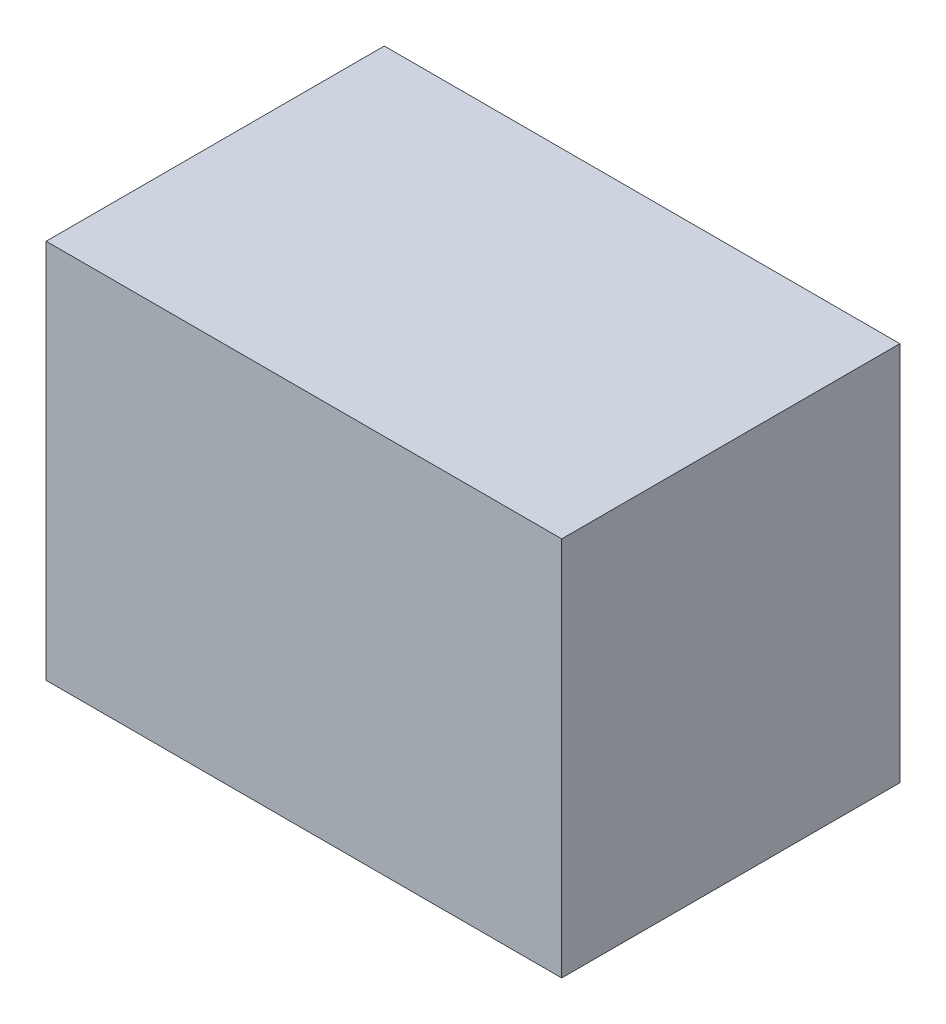
ISO-10303-21;
HEADER;
FILE_DESCRIPTION(('STEP AP214'),'2;1');
FILE_NAME('part.step','',(''),(''),'','','');
FILE_SCHEMA(('AUTOMOTIVE_DESIGN { 1 0 10303 214 1 1 1 1 }'));
ENDSEC;
DATA;
#1=APPLICATION_CONTEXT('core data for automotive mechanical design processes');
#2=APPLICATION_PROTOCOL_DEFINITION('international standard','automotive_design',2000,#1);
#3=PRODUCT_CONTEXT('',#1,'mechanical');
#4=PRODUCT('Part','Part','',(#3));
#5=PRODUCT_RELATED_PRODUCT_CATEGORY('part','',(#4));
#6=PRODUCT_DEFINITION_FORMATION('','',#4);
#7=PRODUCT_DEFINITION_CONTEXT('part definition',#1,'design');
#8=PRODUCT_DEFINITION('design','',#6,#7);
#9=PRODUCT_DEFINITION_SHAPE('','',#8);
#10=(LENGTH_UNIT() NAMED_UNIT(*) SI_UNIT(.MILLI.,.METRE.));
#11=(NAMED_UNIT(*) PLANE_ANGLE_UNIT() SI_UNIT($,.RADIAN.));
#12=(NAMED_UNIT(*) SI_UNIT($,.STERADIAN.) SOLID_ANGLE_UNIT());
#13=UNCERTAINTY_MEASURE_WITH_UNIT(LENGTH_MEASURE(1.E-05),#10,'distance_accuracy_value','');
#14=(GEOMETRIC_REPRESENTATION_CONTEXT(3) GLOBAL_UNCERTAINTY_ASSIGNED_CONTEXT((#13)) GLOBAL_UNIT_ASSIGNED_CONTEXT((#10,
#11,#12)) REPRESENTATION_CONTEXT('',''));
#15=CARTESIAN_POINT('',(0.,0.,0.));
#16=DIRECTION('',(0.,0.,1.));
#17=DIRECTION('',(1.,0.,0.));
#18=AXIS2_PLACEMENT_3D('',#15,#16,#17);
#19=CARTESIAN_POINT('',(0.,0.,10.795));
#20=DIRECTION('',(1.,0.,0.));
#21=DIRECTION('',(0.,0.,-1.));
#22=AXIS2_PLACEMENT_3D('',#19,#20,#21);
#23=PLANE('',#22);
#24=DIRECTION('',(0.,0.707106781186547,0.707106781186547));
#25=VECTOR('',#24,1.);
#26=CARTESIAN_POINT('',(0.,3.48424866300314,9.652));
#27=LINE('',#26,#25);
#28=CARTESIAN_POINT('',(0.,1.778,7.94575133699686));
#29=VERTEX_POINT('',#28);
#30=CARTESIAN_POINT('',(0.,3.48424866300314,9.652));
#31=VERTEX_POINT('',#30);
#32=EDGE_CURVE('E195',#29,#31,#27,.T.);
#33=ORIENTED_EDGE('',*,*,#32,.F.);
#34=DIRECTION('',(0.,0.,1.));
#35=VECTOR('',#34,1.);
#36=CARTESIAN_POINT('',(0.,1.778,7.94575133699686));
#37=LINE('',#36,#35);
#38=CARTESIAN_POINT('',(0.,1.778,1.524));
#39=VERTEX_POINT('',#38);
#40=EDGE_CURVE('E47',#39,#29,#37,.T.);
#41=ORIENTED_EDGE('',*,*,#40,.F.);
#42=DIRECTION('',(0.,-1.,0.));
#43=VECTOR('',#42,1.);
#44=CARTESIAN_POINT('',(0.,1.778,1.524));
#45=LINE('',#44,#43);
#46=CARTESIAN_POINT('',(0.,10.3632,1.524));
#47=VERTEX_POINT('',#46);
#48=EDGE_CURVE('E178',#47,#39,#45,.T.);
#49=ORIENTED_EDGE('',*,*,#48,.F.);
#50=DIRECTION('',(0.,0.,-1.));
#51=VECTOR('',#50,1.);
#52=CARTESIAN_POINT('',(0.,10.3632,1.524));
#53=LINE('',#52,#51);
#54=CARTESIAN_POINT('',(0.,10.3632,7.94575133699686));
#55=VERTEX_POINT('',#54);
#56=EDGE_CURVE('E204',#55,#47,#53,.T.);
#57=ORIENTED_EDGE('',*,*,#56,.F.);
#58=DIRECTION('',(0.,0.707106781186547,-0.707106781186547));
#59=VECTOR('',#58,1.);
#60=CARTESIAN_POINT('',(0.,10.3632,7.94575133699686));
#61=LINE('',#60,#59);
#62=CARTESIAN_POINT('',(0.,8.65695133699686,9.652));
#63=VERTEX_POINT('',#62);
#64=EDGE_CURVE('E201',#63,#55,#61,.T.);
#65=ORIENTED_EDGE('',*,*,#64,.F.);
#66=DIRECTION('',(0.,1.,0.));
#67=VECTOR('',#66,1.);
#68=CARTESIAN_POINT('',(0.,8.65695133699686,9.652));
#69=LINE('',#68,#67);
#70=EDGE_CURVE('E198',#31,#63,#69,.T.);
#71=ORIENTED_EDGE('',*,*,#70,.F.);
#72=EDGE_LOOP('',(#33,#41,#49,#57,#65,#71));
#73=FACE_BOUND('',#72,.T.);
#74=DIRECTION('',(0.,-1.,0.));
#75=VECTOR('',#74,1.);
#76=CARTESIAN_POINT('',(0.,0.,0.));
#77=LINE('',#76,#75);
#78=CARTESIAN_POINT('',(0.,12.1412,0.));
#79=VERTEX_POINT('',#78);
#80=CARTESIAN_POINT('',(0.,0.,0.));
#81=VERTEX_POINT('',#80);
#82=EDGE_CURVE('E211',#79,#81,#77,.T.);
#83=ORIENTED_EDGE('',*,*,#82,.T.);
#84=DIRECTION('',(0.,0.,-1.));
#85=VECTOR('',#84,1.);
#86=CARTESIAN_POINT('',(0.,0.,10.795));
#87=LINE('',#86,#85);
#88=CARTESIAN_POINT('',(0.,0.,10.795));
#89=VERTEX_POINT('',#88);
#90=EDGE_CURVE('E11',#89,#81,#87,.T.);
#91=ORIENTED_EDGE('',*,*,#90,.F.);
#92=DIRECTION('',(0.,-1.,0.));
#93=VECTOR('',#92,1.);
#94=CARTESIAN_POINT('',(0.,0.,10.795));
#95=LINE('',#94,#93);
#96=CARTESIAN_POINT('',(0.,12.1412,10.795));
#97=VERTEX_POINT('',#96);
#98=EDGE_CURVE('E221',#97,#89,#95,.T.);
#99=ORIENTED_EDGE('',*,*,#98,.F.);
#100=DIRECTION('',(0.,0.,-1.));
#101=VECTOR('',#100,1.);
#102=CARTESIAN_POINT('',(0.,12.1412,10.795));
#103=LINE('',#102,#101);
#104=EDGE_CURVE('E231',#97,#79,#103,.T.);
#105=ORIENTED_EDGE('',*,*,#104,.T.);
#106=EDGE_LOOP('',(#83,#91,#99,#105));
#107=FACE_BOUND('',#106,.T.);
#108=ADVANCED_FACE('F33',(#73,#107),#23,.F.);
#109=CARTESIAN_POINT('',(0.,0.,10.795));
#110=DIRECTION('',(0.,1.,0.));
#111=DIRECTION('',(0.,0.,1.));
#112=AXIS2_PLACEMENT_3D('',#109,#110,#111);
#113=PLANE('',#112);
#114=DIRECTION('',(1.,0.,0.));
#115=VECTOR('',#114,1.);
#116=CARTESIAN_POINT('',(0.,0.,0.));
#117=LINE('',#116,#115);
#118=CARTESIAN_POINT('',(16.4592,0.,0.));
#119=VERTEX_POINT('',#118);
#120=EDGE_CURVE('E234',#81,#119,#117,.T.);
#121=ORIENTED_EDGE('',*,*,#120,.T.);
#122=DIRECTION('',(0.,0.,-1.));
#123=VECTOR('',#122,1.);
#124=CARTESIAN_POINT('',(16.4592,0.,10.795));
#125=LINE('',#124,#123);
#126=CARTESIAN_POINT('',(16.4592,0.,10.795));
#127=VERTEX_POINT('',#126);
#128=EDGE_CURVE('E40',#127,#119,#125,.T.);
#129=ORIENTED_EDGE('',*,*,#128,.F.);
#130=DIRECTION('',(1.,0.,0.));
#131=VECTOR('',#130,1.);
#132=CARTESIAN_POINT('',(0.,0.,10.795));
#133=LINE('',#132,#131);
#134=EDGE_CURVE('E224',#89,#127,#133,.T.);
#135=ORIENTED_EDGE('',*,*,#134,.F.);
#136=ORIENTED_EDGE('',*,*,#90,.T.);
#137=EDGE_LOOP('',(#121,#129,#135,#136));
#138=FACE_BOUND('',#137,.T.);
#139=ADVANCED_FACE('F264',(#138),#113,.F.);
#140=CARTESIAN_POINT('',(16.4592,0.,10.795));
#141=DIRECTION('',(-1.,0.,0.));
#142=DIRECTION('',(0.,0.,1.));
#143=AXIS2_PLACEMENT_3D('',#140,#141,#142);
#144=PLANE('',#143);
#145=DIRECTION('',(0.,1.,0.));
#146=VECTOR('',#145,1.);
#147=CARTESIAN_POINT('',(16.4592,0.,0.));
#148=LINE('',#147,#146);
#149=CARTESIAN_POINT('',(16.4592,12.1412,0.));
#150=VERTEX_POINT('',#149);
#151=EDGE_CURVE('E236',#119,#150,#148,.T.);
#152=ORIENTED_EDGE('',*,*,#151,.T.);
#153=DIRECTION('',(0.,0.,-1.));
#154=VECTOR('',#153,1.);
#155=CARTESIAN_POINT('',(16.4592,12.1412,10.795));
#156=LINE('',#155,#154);
#157=CARTESIAN_POINT('',(16.4592,12.1412,10.795));
#158=VERTEX_POINT('',#157);
#159=EDGE_CURVE('E241',#158,#150,#156,.T.);
#160=ORIENTED_EDGE('',*,*,#159,.F.);
#161=DIRECTION('',(0.,1.,0.));
#162=VECTOR('',#161,1.);
#163=CARTESIAN_POINT('',(16.4592,0.,10.795));
#164=LINE('',#163,#162);
#165=EDGE_CURVE('E227',#127,#158,#164,.T.);
#166=ORIENTED_EDGE('',*,*,#165,.F.);
#167=ORIENTED_EDGE('',*,*,#128,.T.);
#168=EDGE_LOOP('',(#152,#160,#166,#167));
#169=FACE_BOUND('',#168,.T.);
#170=ADVANCED_FACE('F248',(#169),#144,.F.);
#171=CARTESIAN_POINT('',(0.,12.1412,10.795));
#172=DIRECTION('',(0.,-1.,0.));
#173=DIRECTION('',(0.,0.,-1.));
#174=AXIS2_PLACEMENT_3D('',#171,#172,#173);
#175=PLANE('',#174);
#176=DIRECTION('',(-1.,0.,0.));
#177=VECTOR('',#176,1.);
#178=CARTESIAN_POINT('',(0.,12.1412,0.));
#179=LINE('',#178,#177);
#180=EDGE_CURVE('E225',#150,#79,#179,.T.);
#181=ORIENTED_EDGE('',*,*,#180,.T.);
#182=ORIENTED_EDGE('',*,*,#104,.F.);
#183=DIRECTION('',(-1.,0.,0.));
#184=VECTOR('',#183,1.);
#185=CARTESIAN_POINT('',(0.,12.1412,10.795));
#186=LINE('',#185,#184);
#187=EDGE_CURVE('E229',#158,#97,#186,.T.);
#188=ORIENTED_EDGE('',*,*,#187,.F.);
#189=ORIENTED_EDGE('',*,*,#159,.T.);
#190=EDGE_LOOP('',(#181,#182,#188,#189));
#191=FACE_BOUND('',#190,.T.);
#192=ADVANCED_FACE('F257',(#191),#175,.F.);
#193=CARTESIAN_POINT('',(0.,0.,10.795));
#194=DIRECTION('',(0.,0.,-1.));
#195=DIRECTION('',(-1.,0.,0.));
#196=AXIS2_PLACEMENT_3D('',#193,#194,#195);
#197=PLANE('',#196);
#198=ORIENTED_EDGE('',*,*,#98,.T.);
#199=ORIENTED_EDGE('',*,*,#134,.T.);
#200=ORIENTED_EDGE('',*,*,#165,.T.);
#201=ORIENTED_EDGE('',*,*,#187,.T.);
#202=EDGE_LOOP('',(#198,#199,#200,#201));
#203=FACE_BOUND('',#202,.T.);
#204=ADVANCED_FACE('F263',(#203),#197,.F.);
#205=CARTESIAN_POINT('',(0.,0.,0.));
#206=DIRECTION('',(0.,0.,-1.));
#207=DIRECTION('',(-1.,0.,0.));
#208=AXIS2_PLACEMENT_3D('',#205,#206,#207);
#209=PLANE('',#208);
#210=ORIENTED_EDGE('',*,*,#82,.F.);
#211=ORIENTED_EDGE('',*,*,#180,.F.);
#212=ORIENTED_EDGE('',*,*,#151,.F.);
#213=ORIENTED_EDGE('',*,*,#120,.F.);
#214=EDGE_LOOP('',(#210,#211,#212,#213));
#215=FACE_BOUND('',#214,.T.);
#216=ADVANCED_FACE('F254',(#215),#209,.T.);
#217=CARTESIAN_POINT('',(9.017,1.778,7.94575133699686));
#218=DIRECTION('',(0.,-1.,0.));
#219=DIRECTION('',(0.,0.,-1.));
#220=AXIS2_PLACEMENT_3D('',#217,#218,#219);
#221=PLANE('',#220);
#222=ORIENTED_EDGE('',*,*,#40,.T.);
#223=DIRECTION('',(-1.,0.,0.));
#224=VECTOR('',#223,1.);
#225=CARTESIAN_POINT('',(9.017,1.778,7.94575133699686));
#226=LINE('',#225,#224);
#227=CARTESIAN_POINT('',(9.017,1.778,7.94575133699686));
#228=VERTEX_POINT('',#227);
#229=EDGE_CURVE('E193',#228,#29,#226,.T.);
#230=ORIENTED_EDGE('',*,*,#229,.F.);
#231=DIRECTION('',(0.,0.,1.));
#232=VECTOR('',#231,1.);
#233=CARTESIAN_POINT('',(9.017,1.778,7.94575133699686));
#234=LINE('',#233,#232);
#235=CARTESIAN_POINT('',(9.017,1.778,1.524));
#236=VERTEX_POINT('',#235);
#237=EDGE_CURVE('E174',#236,#228,#234,.T.);
#238=ORIENTED_EDGE('',*,*,#237,.F.);
#239=DIRECTION('',(-1.,0.,0.));
#240=VECTOR('',#239,1.);
#241=CARTESIAN_POINT('',(9.017,1.778,1.524));
#242=LINE('',#241,#240);
#243=EDGE_CURVE('E209',#236,#39,#242,.T.);
#244=ORIENTED_EDGE('',*,*,#243,.T.);
#245=EDGE_LOOP('',(#222,#230,#238,#244));
#246=FACE_BOUND('',#245,.T.);
#247=ADVANCED_FACE('F278',(#246),#221,.F.);
#248=CARTESIAN_POINT('',(9.017,1.778,1.524));
#249=DIRECTION('',(0.,0.,-1.));
#250=DIRECTION('',(-1.,0.,0.));
#251=AXIS2_PLACEMENT_3D('',#248,#249,#250);
#252=PLANE('',#251);
#253=ORIENTED_EDGE('',*,*,#48,.T.);
#254=ORIENTED_EDGE('',*,*,#243,.F.);
#255=DIRECTION('',(0.,-1.,0.));
#256=VECTOR('',#255,1.);
#257=CARTESIAN_POINT('',(9.017,1.778,1.524));
#258=LINE('',#257,#256);
#259=CARTESIAN_POINT('',(9.017,10.3632,1.524));
#260=VERTEX_POINT('',#259);
#261=EDGE_CURVE('E190',#260,#236,#258,.T.);
#262=ORIENTED_EDGE('',*,*,#261,.F.);
#263=DIRECTION('',(-1.,0.,0.));
#264=VECTOR('',#263,1.);
#265=CARTESIAN_POINT('',(9.017,10.3632,1.524));
#266=LINE('',#265,#264);
#267=EDGE_CURVE('E212',#260,#47,#266,.T.);
#268=ORIENTED_EDGE('',*,*,#267,.T.);
#269=EDGE_LOOP('',(#253,#254,#262,#268));
#270=FACE_BOUND('',#269,.T.);
#271=ADVANCED_FACE('F283',(#270),#252,.F.);
#272=CARTESIAN_POINT('',(9.017,10.3632,1.524));
#273=DIRECTION('',(0.,1.,0.));
#274=DIRECTION('',(0.,0.,1.));
#275=AXIS2_PLACEMENT_3D('',#272,#273,#274);
#276=PLANE('',#275);
#277=ORIENTED_EDGE('',*,*,#56,.T.);
#278=ORIENTED_EDGE('',*,*,#267,.F.);
#279=DIRECTION('',(0.,0.,-1.));
#280=VECTOR('',#279,1.);
#281=CARTESIAN_POINT('',(9.017,10.3632,1.524));
#282=LINE('',#281,#280);
#283=CARTESIAN_POINT('',(9.017,10.3632,7.94575133699686));
#284=VERTEX_POINT('',#283);
#285=EDGE_CURVE('E187',#284,#260,#282,.T.);
#286=ORIENTED_EDGE('',*,*,#285,.F.);
#287=DIRECTION('',(-1.,0.,0.));
#288=VECTOR('',#287,1.);
#289=CARTESIAN_POINT('',(9.017,10.3632,7.94575133699686));
#290=LINE('',#289,#288);
#291=EDGE_CURVE('E214',#284,#55,#290,.T.);
#292=ORIENTED_EDGE('',*,*,#291,.T.);
#293=EDGE_LOOP('',(#277,#278,#286,#292));
#294=FACE_BOUND('',#293,.T.);
#295=ADVANCED_FACE('F295',(#294),#276,.F.);
#296=CARTESIAN_POINT('',(9.017,10.3632,7.94575133699686));
#297=DIRECTION('',(0.,0.707106781186547,0.707106781186547));
#298=DIRECTION('',(0.,-0.707106781186548,0.707106781186548));
#299=AXIS2_PLACEMENT_3D('',#296,#297,#298);
#300=PLANE('',#299);
#301=ORIENTED_EDGE('',*,*,#64,.T.);
#302=ORIENTED_EDGE('',*,*,#291,.F.);
#303=DIRECTION('',(0.,0.707106781186547,-0.707106781186547));
#304=VECTOR('',#303,1.);
#305=CARTESIAN_POINT('',(9.017,10.3632,7.94575133699686));
#306=LINE('',#305,#304);
#307=CARTESIAN_POINT('',(9.017,8.65695133699686,9.652));
#308=VERTEX_POINT('',#307);
#309=EDGE_CURVE('E184',#308,#284,#306,.T.);
#310=ORIENTED_EDGE('',*,*,#309,.F.);
#311=DIRECTION('',(-1.,0.,0.));
#312=VECTOR('',#311,1.);
#313=CARTESIAN_POINT('',(9.017,8.65695133699686,9.652));
#314=LINE('',#313,#312);
#315=EDGE_CURVE('E216',#308,#63,#314,.T.);
#316=ORIENTED_EDGE('',*,*,#315,.T.);
#317=EDGE_LOOP('',(#301,#302,#310,#316));
#318=FACE_BOUND('',#317,.T.);
#319=ADVANCED_FACE('F291',(#318),#300,.F.);
#320=CARTESIAN_POINT('',(9.017,8.65695133699686,9.652));
#321=DIRECTION('',(0.,0.,1.));
#322=DIRECTION('',(1.,0.,0.));
#323=AXIS2_PLACEMENT_3D('',#320,#321,#322);
#324=PLANE('',#323);
#325=ORIENTED_EDGE('',*,*,#70,.T.);
#326=ORIENTED_EDGE('',*,*,#315,.F.);
#327=DIRECTION('',(0.,1.,0.));
#328=VECTOR('',#327,1.);
#329=CARTESIAN_POINT('',(9.017,8.65695133699686,9.652));
#330=LINE('',#329,#328);
#331=CARTESIAN_POINT('',(9.017,3.48424866300314,9.652));
#332=VERTEX_POINT('',#331);
#333=EDGE_CURVE('E181',#332,#308,#330,.T.);
#334=ORIENTED_EDGE('',*,*,#333,.F.);
#335=DIRECTION('',(-1.,0.,0.));
#336=VECTOR('',#335,1.);
#337=CARTESIAN_POINT('',(9.017,3.48424866300314,9.652));
#338=LINE('',#337,#336);
#339=EDGE_CURVE('E218',#332,#31,#338,.T.);
#340=ORIENTED_EDGE('',*,*,#339,.T.);
#341=EDGE_LOOP('',(#325,#326,#334,#340));
#342=FACE_BOUND('',#341,.T.);
#343=ADVANCED_FACE('F287',(#342),#324,.F.);
#344=CARTESIAN_POINT('',(9.017,3.48424866300314,9.652));
#345=DIRECTION('',(0.,-0.707106781186547,0.707106781186547));
#346=DIRECTION('',(0.,-0.707106781186548,-0.707106781186548));
#347=AXIS2_PLACEMENT_3D('',#344,#345,#346);
#348=PLANE('',#347);
#349=ORIENTED_EDGE('',*,*,#32,.T.);
#350=ORIENTED_EDGE('',*,*,#339,.F.);
#351=DIRECTION('',(0.,0.707106781186547,0.707106781186547));
#352=VECTOR('',#351,1.);
#353=CARTESIAN_POINT('',(9.017,3.48424866300314,9.652));
#354=LINE('',#353,#352);
#355=EDGE_CURVE('E177',#228,#332,#354,.T.);
#356=ORIENTED_EDGE('',*,*,#355,.F.);
#357=ORIENTED_EDGE('',*,*,#229,.T.);
#358=EDGE_LOOP('',(#349,#350,#356,#357));
#359=FACE_BOUND('',#358,.T.);
#360=ADVANCED_FACE('F284',(#359),#348,.F.);
#361=CARTESIAN_POINT('',(9.017,0.,0.));
#362=DIRECTION('',(1.,0.,0.));
#363=DIRECTION('',(0.,0.,-1.));
#364=AXIS2_PLACEMENT_3D('',#361,#362,#363);
#365=PLANE('',#364);
#366=DIRECTION('',(0.,1.,0.));
#367=VECTOR('',#366,1.);
#368=CARTESIAN_POINT('',(9.017,3.3401,6.9342));
#369=LINE('',#368,#367);
#370=CARTESIAN_POINT('',(9.017,3.3401,6.9342));
#371=VERTEX_POINT('',#370);
#372=CARTESIAN_POINT('',(9.017,8.8011,6.9342));
#373=VERTEX_POINT('',#372);
#374=EDGE_CURVE('E152',#371,#373,#369,.T.);
#375=ORIENTED_EDGE('',*,*,#374,.F.);
#376=DIRECTION('',(0.,0.,1.));
#377=VECTOR('',#376,1.);
#378=CARTESIAN_POINT('',(9.017,3.3401,3.937));
#379=LINE('',#378,#377);
#380=CARTESIAN_POINT('',(9.017,3.3401,3.937));
#381=VERTEX_POINT('',#380);
#382=EDGE_CURVE('E145',#381,#371,#379,.T.);
#383=ORIENTED_EDGE('',*,*,#382,.F.);
#384=DIRECTION('',(0.,-1.,0.));
#385=VECTOR('',#384,1.);
#386=CARTESIAN_POINT('',(9.017,3.3401,3.937));
#387=LINE('',#386,#385);
#388=CARTESIAN_POINT('',(9.017,8.8011,3.937));
#389=VERTEX_POINT('',#388);
#390=EDGE_CURVE('E155',#389,#381,#387,.T.);
#391=ORIENTED_EDGE('',*,*,#390,.F.);
#392=DIRECTION('',(0.,0.,-1.));
#393=VECTOR('',#392,1.);
#394=CARTESIAN_POINT('',(9.017,8.8011,3.937));
#395=LINE('',#394,#393);
#396=EDGE_CURVE('E137',#373,#389,#395,.T.);
#397=ORIENTED_EDGE('',*,*,#396,.F.);
#398=EDGE_LOOP('',(#375,#383,#391,#397));
#399=FACE_BOUND('',#398,.T.);
#400=ORIENTED_EDGE('',*,*,#237,.T.);
#401=ORIENTED_EDGE('',*,*,#355,.T.);
#402=ORIENTED_EDGE('',*,*,#333,.T.);
#403=ORIENTED_EDGE('',*,*,#309,.T.);
#404=ORIENTED_EDGE('',*,*,#285,.T.);
#405=ORIENTED_EDGE('',*,*,#261,.T.);
#406=EDGE_LOOP('',(#400,#401,#402,#403,#404,#405));
#407=FACE_BOUND('',#406,.T.);
#408=ADVANCED_FACE('F149',(#399,#407),#365,.F.);
#409=CARTESIAN_POINT('',(9.017,3.3401,6.9342));
#410=DIRECTION('',(0.,0.,1.));
#411=DIRECTION('',(1.,0.,0.));
#412=AXIS2_PLACEMENT_3D('',#409,#410,#411);
#413=PLANE('',#412);
#414=DIRECTION('',(0.,1.,0.));
#415=VECTOR('',#414,1.);
#416=CARTESIAN_POINT('',(0.,3.3401,6.9342));
#417=LINE('',#416,#415);
#418=CARTESIAN_POINT('',(0.,3.3401,6.9342));
#419=VERTEX_POINT('',#418);
#420=CARTESIAN_POINT('',(0.,8.8011,6.9342));
#421=VERTEX_POINT('',#420);
#422=EDGE_CURVE('E166',#419,#421,#417,.T.);
#423=ORIENTED_EDGE('',*,*,#422,.F.);
#424=DIRECTION('',(-1.,0.,0.));
#425=VECTOR('',#424,1.);
#426=CARTESIAN_POINT('',(9.017,3.3401,6.9342));
#427=LINE('',#426,#425);
#428=EDGE_CURVE('E158',#371,#419,#427,.T.);
#429=ORIENTED_EDGE('',*,*,#428,.F.);
#430=ORIENTED_EDGE('',*,*,#374,.T.);
#431=DIRECTION('',(-1.,0.,0.));
#432=VECTOR('',#431,1.);
#433=CARTESIAN_POINT('',(9.017,8.8011,6.9342));
#434=LINE('',#433,#432);
#435=EDGE_CURVE('E134',#373,#421,#434,.T.);
#436=ORIENTED_EDGE('',*,*,#435,.T.);
#437=EDGE_LOOP('',(#423,#429,#430,#436));
#438=FACE_BOUND('',#437,.T.);
#439=ADVANCED_FACE('F157',(#438),#413,.T.);
#440=CARTESIAN_POINT('',(9.017,3.3401,3.937));
#441=DIRECTION('',(0.,-1.,0.));
#442=DIRECTION('',(0.,0.,-1.));
#443=AXIS2_PLACEMENT_3D('',#440,#441,#442);
#444=PLANE('',#443);
#445=DIRECTION('',(0.,0.,1.));
#446=VECTOR('',#445,1.);
#447=CARTESIAN_POINT('',(0.,3.3401,3.937));
#448=LINE('',#447,#446);
#449=CARTESIAN_POINT('',(0.,3.3401,3.937));
#450=VERTEX_POINT('',#449);
#451=EDGE_CURVE('E159',#450,#419,#448,.T.);
#452=ORIENTED_EDGE('',*,*,#451,.F.);
#453=DIRECTION('',(-1.,0.,0.));
#454=VECTOR('',#453,1.);
#455=CARTESIAN_POINT('',(9.017,3.3401,3.937));
#456=LINE('',#455,#454);
#457=EDGE_CURVE('E171',#381,#450,#456,.T.);
#458=ORIENTED_EDGE('',*,*,#457,.F.);
#459=ORIENTED_EDGE('',*,*,#382,.T.);
#460=ORIENTED_EDGE('',*,*,#428,.T.);
#461=EDGE_LOOP('',(#452,#458,#459,#460));
#462=FACE_BOUND('',#461,.T.);
#463=ADVANCED_FACE('F307',(#462),#444,.T.);
#464=CARTESIAN_POINT('',(9.017,3.3401,3.937));
#465=DIRECTION('',(0.,0.,-1.));
#466=DIRECTION('',(-1.,0.,0.));
#467=AXIS2_PLACEMENT_3D('',#464,#465,#466);
#468=PLANE('',#467);
#469=DIRECTION('',(0.,-1.,0.));
#470=VECTOR('',#469,1.);
#471=CARTESIAN_POINT('',(0.,3.3401,3.937));
#472=LINE('',#471,#470);
#473=CARTESIAN_POINT('',(0.,8.8011,3.937));
#474=VERTEX_POINT('',#473);
#475=EDGE_CURVE('E55',#474,#450,#472,.T.);
#476=ORIENTED_EDGE('',*,*,#475,.F.);
#477=DIRECTION('',(-1.,0.,0.));
#478=VECTOR('',#477,1.);
#479=CARTESIAN_POINT('',(9.017,8.8011,3.937));
#480=LINE('',#479,#478);
#481=EDGE_CURVE('E144',#389,#474,#480,.T.);
#482=ORIENTED_EDGE('',*,*,#481,.F.);
#483=ORIENTED_EDGE('',*,*,#390,.T.);
#484=ORIENTED_EDGE('',*,*,#457,.T.);
#485=EDGE_LOOP('',(#476,#482,#483,#484));
#486=FACE_BOUND('',#485,.T.);
#487=ADVANCED_FACE('F310',(#486),#468,.T.);
#488=CARTESIAN_POINT('',(9.017,8.8011,3.937));
#489=DIRECTION('',(0.,1.,0.));
#490=DIRECTION('',(0.,0.,1.));
#491=AXIS2_PLACEMENT_3D('',#488,#489,#490);
#492=PLANE('',#491);
#493=DIRECTION('',(0.,0.,-1.));
#494=VECTOR('',#493,1.);
#495=CARTESIAN_POINT('',(0.,8.8011,3.937));
#496=LINE('',#495,#494);
#497=EDGE_CURVE('E139',#421,#474,#496,.T.);
#498=ORIENTED_EDGE('',*,*,#497,.F.);
#499=ORIENTED_EDGE('',*,*,#435,.F.);
#500=ORIENTED_EDGE('',*,*,#396,.T.);
#501=ORIENTED_EDGE('',*,*,#481,.T.);
#502=EDGE_LOOP('',(#498,#499,#500,#501));
#503=FACE_BOUND('',#502,.T.);
#504=ADVANCED_FACE('F136',(#503),#492,.T.);
#505=ORIENTED_EDGE('',*,*,#422,.T.);
#506=ORIENTED_EDGE('',*,*,#497,.T.);
#507=ORIENTED_EDGE('',*,*,#475,.T.);
#508=ORIENTED_EDGE('',*,*,#451,.T.);
#509=EDGE_LOOP('',(#505,#506,#507,#508));
#510=FACE_BOUND('',#509,.T.);
#511=ADVANCED_FACE('F272',(#510),#23,.F.);
#512=CLOSED_SHELL('',(#108,#139,#170,#192,#204,#216,#247,#271,#295,#319,#343,#360,#408,#439,
#463,#487,#504,#511));
#513=MANIFOLD_SOLID_BREP('B2',#512);
#514=ADVANCED_BREP_SHAPE_REPRESENTATION('',(#18,#513),#14);
#515=SHAPE_DEFINITION_REPRESENTATION(#9,#514);
ENDSEC;
END-ISO-10303-21;
